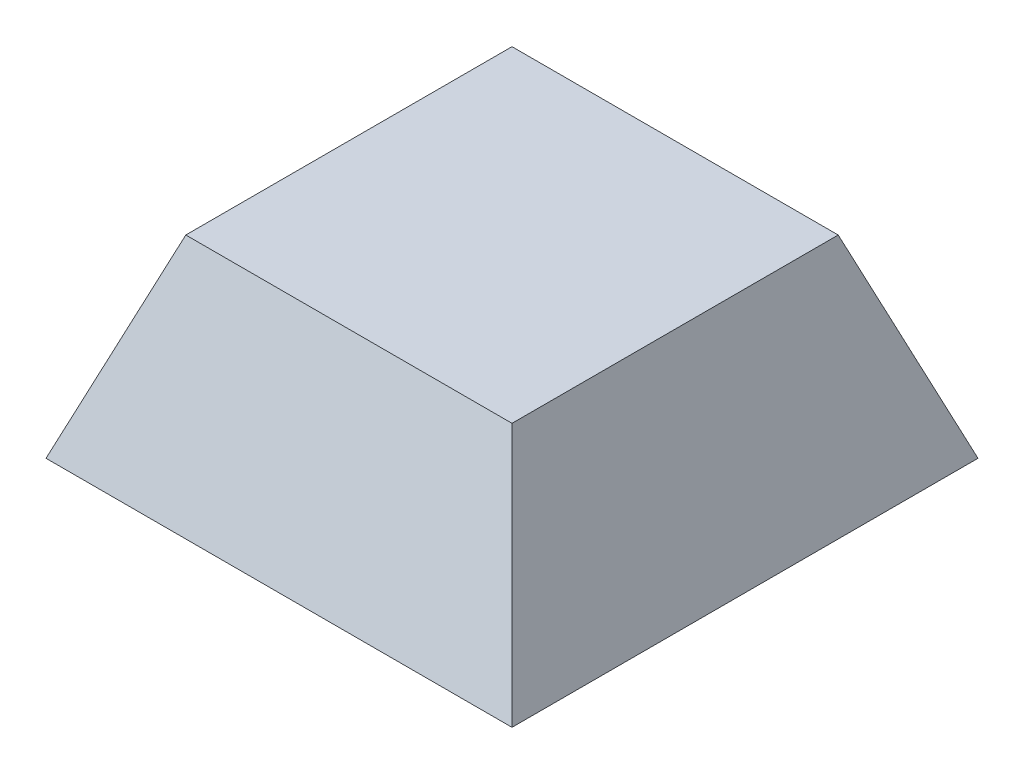
ISO-10303-21;
HEADER;
FILE_DESCRIPTION(('STEP AP214'),'2;1');
FILE_NAME('part.step','',(''),(''),'','','');
FILE_SCHEMA(('AUTOMOTIVE_DESIGN { 1 0 10303 214 1 1 1 1 }'));
ENDSEC;
DATA;
#1=APPLICATION_CONTEXT('core data for automotive mechanical design processes');
#2=APPLICATION_PROTOCOL_DEFINITION('international standard','automotive_design',2000,#1);
#3=PRODUCT_CONTEXT('',#1,'mechanical');
#4=PRODUCT('Part','Part','',(#3));
#5=PRODUCT_RELATED_PRODUCT_CATEGORY('part','',(#4));
#6=PRODUCT_DEFINITION_FORMATION('','',#4);
#7=PRODUCT_DEFINITION_CONTEXT('part definition',#1,'design');
#8=PRODUCT_DEFINITION('design','',#6,#7);
#9=PRODUCT_DEFINITION_SHAPE('','',#8);
#10=(LENGTH_UNIT() NAMED_UNIT(*) SI_UNIT(.MILLI.,.METRE.));
#11=(NAMED_UNIT(*) PLANE_ANGLE_UNIT() SI_UNIT($,.RADIAN.));
#12=(NAMED_UNIT(*) SI_UNIT($,.STERADIAN.) SOLID_ANGLE_UNIT());
#13=UNCERTAINTY_MEASURE_WITH_UNIT(LENGTH_MEASURE(1.E-05),#10,'distance_accuracy_value','');
#14=(GEOMETRIC_REPRESENTATION_CONTEXT(3) GLOBAL_UNCERTAINTY_ASSIGNED_CONTEXT((#13)) GLOBAL_UNIT_ASSIGNED_CONTEXT((#10,
#11,#12)) REPRESENTATION_CONTEXT('',''));
#15=CARTESIAN_POINT('',(0.,0.,0.));
#16=DIRECTION('',(0.,0.,1.));
#17=DIRECTION('',(1.,0.,0.));
#18=AXIS2_PLACEMENT_3D('',#15,#16,#17);
#19=CARTESIAN_POINT('',(0.,8.3,0.));
#20=DIRECTION('',(0.,1.,0.));
#21=DIRECTION('',(0.,0.,1.));
#22=AXIS2_PLACEMENT_3D('',#19,#20,#21);
#23=PLANE('',#22);
#24=DIRECTION('',(0.,0.,1.));
#25=VECTOR('',#24,1.);
#26=CARTESIAN_POINT('',(-7.,8.3,-10.));
#27=LINE('',#26,#25);
#28=CARTESIAN_POINT('',(-7.,8.3,-7.));
#29=VERTEX_POINT('',#28);
#30=CARTESIAN_POINT('',(-7.,8.3,7.));
#31=VERTEX_POINT('',#30);
#32=EDGE_CURVE('E101',#29,#31,#27,.T.);
#33=ORIENTED_EDGE('',*,*,#32,.T.);
#34=DIRECTION('',(1.,0.,0.));
#35=VECTOR('',#34,1.);
#36=CARTESIAN_POINT('',(-10.,8.3,7.));
#37=LINE('',#36,#35);
#38=CARTESIAN_POINT('',(7.,8.3,7.));
#39=VERTEX_POINT('',#38);
#40=EDGE_CURVE('E51',#31,#39,#37,.T.);
#41=ORIENTED_EDGE('',*,*,#40,.T.);
#42=DIRECTION('',(0.,0.,1.));
#43=VECTOR('',#42,1.);
#44=CARTESIAN_POINT('',(7.,8.3,-10.));
#45=LINE('',#44,#43);
#46=CARTESIAN_POINT('',(7.,8.3,-7.));
#47=VERTEX_POINT('',#46);
#48=EDGE_CURVE('E91',#47,#39,#45,.T.);
#49=ORIENTED_EDGE('',*,*,#48,.F.);
#50=DIRECTION('',(1.,0.,0.));
#51=VECTOR('',#50,1.);
#52=CARTESIAN_POINT('',(-10.,8.3,-7.));
#53=LINE('',#52,#51);
#54=EDGE_CURVE('E107',#29,#47,#53,.T.);
#55=ORIENTED_EDGE('',*,*,#54,.F.);
#56=EDGE_LOOP('',(#33,#41,#49,#55));
#57=FACE_BOUND('',#56,.T.);
#58=ADVANCED_FACE('F36',(#57),#23,.T.);
#59=CARTESIAN_POINT('',(7.,8.3,-10.));
#60=DIRECTION('',(0.940453312460655,0.339922884021924,0.));
#61=DIRECTION('',(-0.339922884021924,0.940453312460655,0.));
#62=AXIS2_PLACEMENT_3D('',#59,#60,#61);
#63=PLANE('',#62);
#64=ORIENTED_EDGE('',*,*,#48,.T.);
#65=DIRECTION('',(0.321837285156894,-0.890416488934072,0.321837285156893));
#66=VECTOR('',#65,1.);
#67=CARTESIAN_POINT('',(5.23915295200828,13.1716768327771,5.23915295200829));
#68=LINE('',#67,#66);
#69=CARTESIAN_POINT('',(10.,0.,10.));
#70=VERTEX_POINT('',#69);
#71=EDGE_CURVE('E77',#39,#70,#68,.T.);
#72=ORIENTED_EDGE('',*,*,#71,.T.);
#73=DIRECTION('',(0.,0.,-1.));
#74=VECTOR('',#73,1.);
#75=CARTESIAN_POINT('',(10.,0.,-10.));
#76=LINE('',#75,#74);
#77=CARTESIAN_POINT('',(10.,0.,-10.));
#78=VERTEX_POINT('',#77);
#79=EDGE_CURVE('E82',#70,#78,#76,.T.);
#80=ORIENTED_EDGE('',*,*,#79,.T.);
#81=DIRECTION('',(-0.321837285156894,0.890416488934072,0.321837285156894));
#82=VECTOR('',#81,1.);
#83=CARTESIAN_POINT('',(7.31073771435148,7.44029232362757,-7.31073771435148));
#84=LINE('',#83,#82);
#85=EDGE_CURVE('E92',#78,#47,#84,.T.);
#86=ORIENTED_EDGE('',*,*,#85,.T.);
#87=EDGE_LOOP('',(#64,#72,#80,#86));
#88=FACE_BOUND('',#87,.T.);
#89=ADVANCED_FACE('F88',(#88),#63,.T.);
#90=CARTESIAN_POINT('',(-10.,0.,-10.));
#91=DIRECTION('',(-0.940453312460655,0.339922884021923,0.));
#92=DIRECTION('',(-0.339922884021923,-0.940453312460655,0.));
#93=AXIS2_PLACEMENT_3D('',#90,#91,#92);
#94=PLANE('',#93);
#95=DIRECTION('',(0.,0.,1.));
#96=VECTOR('',#95,1.);
#97=CARTESIAN_POINT('',(-10.,0.,-10.));
#98=LINE('',#97,#96);
#99=CARTESIAN_POINT('',(-10.,0.,-10.));
#100=VERTEX_POINT('',#99);
#101=CARTESIAN_POINT('',(-10.,0.,10.));
#102=VERTEX_POINT('',#101);
#103=EDGE_CURVE('E83',#100,#102,#98,.T.);
#104=ORIENTED_EDGE('',*,*,#103,.T.);
#105=DIRECTION('',(0.321837285156893,0.890416488934072,-0.321837285156893));
#106=VECTOR('',#105,1.);
#107=CARTESIAN_POINT('',(-7.92841523765681,5.7313845091495,7.92841523765681));
#108=LINE('',#107,#106);
#109=EDGE_CURVE('E12',#102,#31,#108,.T.);
#110=ORIENTED_EDGE('',*,*,#109,.T.);
#111=ORIENTED_EDGE('',*,*,#32,.F.);
#112=DIRECTION('',(-0.321837285156893,-0.890416488934072,-0.321837285156894));
#113=VECTOR('',#112,1.);
#114=CARTESIAN_POINT('',(-10.,0.,-10.));
#115=LINE('',#114,#113);
#116=EDGE_CURVE('E44',#29,#100,#115,.T.);
#117=ORIENTED_EDGE('',*,*,#116,.T.);
#118=EDGE_LOOP('',(#104,#110,#111,#117));
#119=FACE_BOUND('',#118,.T.);
#120=ADVANCED_FACE('F99',(#119),#94,.T.);
#121=CARTESIAN_POINT('',(0.,0.,0.));
#122=DIRECTION('',(0.,1.,0.));
#123=DIRECTION('',(0.,0.,1.));
#124=AXIS2_PLACEMENT_3D('',#121,#122,#123);
#125=PLANE('',#124);
#126=ORIENTED_EDGE('',*,*,#103,.F.);
#127=DIRECTION('',(-1.,0.,0.));
#128=VECTOR('',#127,1.);
#129=CARTESIAN_POINT('',(-10.,0.,-10.));
#130=LINE('',#129,#128);
#131=EDGE_CURVE('E58',#78,#100,#130,.T.);
#132=ORIENTED_EDGE('',*,*,#131,.F.);
#133=ORIENTED_EDGE('',*,*,#79,.F.);
#134=DIRECTION('',(1.,0.,0.));
#135=VECTOR('',#134,1.);
#136=CARTESIAN_POINT('',(-10.,0.,10.));
#137=LINE('',#136,#135);
#138=EDGE_CURVE('E74',#102,#70,#137,.T.);
#139=ORIENTED_EDGE('',*,*,#138,.F.);
#140=EDGE_LOOP('',(#126,#132,#133,#139));
#141=FACE_BOUND('',#140,.T.);
#142=ADVANCED_FACE('F38',(#141),#125,.F.);
#143=CARTESIAN_POINT('',(-10.,0.,-10.));
#144=DIRECTION('',(0.,0.339922884021924,-0.940453312460655));
#145=DIRECTION('',(0.,0.940453312460655,0.339922884021924));
#146=AXIS2_PLACEMENT_3D('',#143,#144,#145);
#147=PLANE('',#146);
#148=ORIENTED_EDGE('',*,*,#131,.T.);
#149=ORIENTED_EDGE('',*,*,#116,.F.);
#150=ORIENTED_EDGE('',*,*,#54,.T.);
#151=ORIENTED_EDGE('',*,*,#85,.F.);
#152=EDGE_LOOP('',(#148,#149,#150,#151));
#153=FACE_BOUND('',#152,.T.);
#154=ADVANCED_FACE('F110',(#153),#147,.T.);
#155=CARTESIAN_POINT('',(-10.,8.3,7.));
#156=DIRECTION('',(0.,0.339922884021923,0.940453312460655));
#157=DIRECTION('',(0.,-0.940453312460655,0.339922884021923));
#158=AXIS2_PLACEMENT_3D('',#155,#156,#157);
#159=PLANE('',#158);
#160=ORIENTED_EDGE('',*,*,#40,.F.);
#161=ORIENTED_EDGE('',*,*,#109,.F.);
#162=ORIENTED_EDGE('',*,*,#138,.T.);
#163=ORIENTED_EDGE('',*,*,#71,.F.);
#164=EDGE_LOOP('',(#160,#161,#162,#163));
#165=FACE_BOUND('',#164,.T.);
#166=ADVANCED_FACE('F76',(#165),#159,.T.);
#167=CLOSED_SHELL('',(#58,#89,#120,#142,#154,#166));
#168=MANIFOLD_SOLID_BREP('B2',#167);
#169=ADVANCED_BREP_SHAPE_REPRESENTATION('',(#18,#168),#14);
#170=SHAPE_DEFINITION_REPRESENTATION(#9,#169);
ENDSEC;
END-ISO-10303-21;
